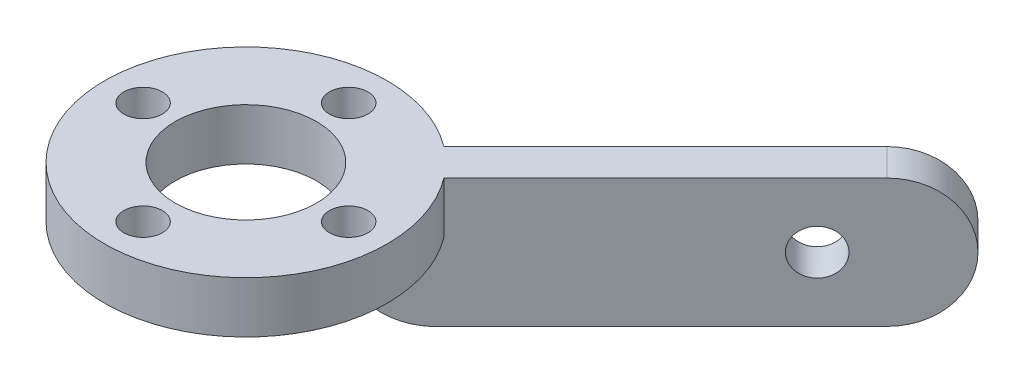
ISO-10303-21;
HEADER;
FILE_DESCRIPTION(('STEP AP214'),'2;1');
FILE_NAME('part.step','',(''),(''),'','','');
FILE_SCHEMA(('AUTOMOTIVE_DESIGN { 1 0 10303 214 1 1 1 1 }'));
ENDSEC;
DATA;
#1=APPLICATION_CONTEXT('core data for automotive mechanical design processes');
#2=APPLICATION_PROTOCOL_DEFINITION('international standard','automotive_design',2000,#1);
#3=PRODUCT_CONTEXT('',#1,'mechanical');
#4=PRODUCT('Part','Part','',(#3));
#5=PRODUCT_RELATED_PRODUCT_CATEGORY('part','',(#4));
#6=PRODUCT_DEFINITION_FORMATION('','',#4);
#7=PRODUCT_DEFINITION_CONTEXT('part definition',#1,'design');
#8=PRODUCT_DEFINITION('design','',#6,#7);
#9=PRODUCT_DEFINITION_SHAPE('','',#8);
#10=(LENGTH_UNIT() NAMED_UNIT(*) SI_UNIT(.MILLI.,.METRE.));
#11=(NAMED_UNIT(*) PLANE_ANGLE_UNIT() SI_UNIT($,.RADIAN.));
#12=(NAMED_UNIT(*) SI_UNIT($,.STERADIAN.) SOLID_ANGLE_UNIT());
#13=UNCERTAINTY_MEASURE_WITH_UNIT(LENGTH_MEASURE(1.E-05),#10,'distance_accuracy_value','');
#14=(GEOMETRIC_REPRESENTATION_CONTEXT(3) GLOBAL_UNCERTAINTY_ASSIGNED_CONTEXT((#13)) GLOBAL_UNIT_ASSIGNED_CONTEXT((#10,
#11,#12)) REPRESENTATION_CONTEXT('',''));
#15=CARTESIAN_POINT('',(0.,0.,0.));
#16=DIRECTION('',(0.,0.,1.));
#17=DIRECTION('',(1.,0.,0.));
#18=AXIS2_PLACEMENT_3D('',#15,#16,#17);
#19=CARTESIAN_POINT('',(0.,0.,0.));
#20=DIRECTION('',(0.,1.,0.));
#21=DIRECTION('',(0.,0.,1.));
#22=AXIS2_PLACEMENT_3D('',#19,#20,#21);
#23=PLANE('',#22);
#24=CARTESIAN_POINT('',(0.,0.,8.));
#25=DIRECTION('',(0.,1.,0.));
#26=DIRECTION('',(0.,0.,1.));
#27=AXIS2_PLACEMENT_3D('',#24,#25,#26);
#28=CIRCLE('',#27,1.5);
#29=CARTESIAN_POINT('',(0.,0.,9.5));
#30=VERTEX_POINT('',#29);
#31=EDGE_CURVE('E230',#30,#30,#28,.T.);
#32=ORIENTED_EDGE('',*,*,#31,.T.);
#33=EDGE_LOOP('',(#32));
#34=FACE_BOUND('',#33,.T.);
#35=CARTESIAN_POINT('',(8.,0.,0.));
#36=DIRECTION('',(0.,1.,0.));
#37=DIRECTION('',(0.,0.,1.));
#38=AXIS2_PLACEMENT_3D('',#35,#36,#37);
#39=CIRCLE('',#38,1.5);
#40=CARTESIAN_POINT('',(8.,0.,1.50000000000005));
#41=VERTEX_POINT('',#40);
#42=EDGE_CURVE('E224',#41,#41,#39,.T.);
#43=ORIENTED_EDGE('',*,*,#42,.T.);
#44=EDGE_LOOP('',(#43));
#45=FACE_BOUND('',#44,.T.);
#46=CARTESIAN_POINT('',(0.,0.,-8.));
#47=DIRECTION('',(0.,1.,0.));
#48=DIRECTION('',(0.,0.,1.));
#49=AXIS2_PLACEMENT_3D('',#46,#47,#48);
#50=CIRCLE('',#49,1.5);
#51=CARTESIAN_POINT('',(0.,0.,-6.5));
#52=VERTEX_POINT('',#51);
#53=EDGE_CURVE('E218',#52,#52,#50,.T.);
#54=ORIENTED_EDGE('',*,*,#53,.T.);
#55=EDGE_LOOP('',(#54));
#56=FACE_BOUND('',#55,.T.);
#57=CARTESIAN_POINT('',(-8.,0.,0.));
#58=DIRECTION('',(0.,1.,0.));
#59=DIRECTION('',(0.,0.,1.));
#60=AXIS2_PLACEMENT_3D('',#57,#58,#59);
#61=CIRCLE('',#60,1.5);
#62=CARTESIAN_POINT('',(-8.,0.,1.5));
#63=VERTEX_POINT('',#62);
#64=EDGE_CURVE('E210',#63,#63,#61,.T.);
#65=ORIENTED_EDGE('',*,*,#64,.T.);
#66=EDGE_LOOP('',(#65));
#67=FACE_BOUND('',#66,.T.);
#68=CARTESIAN_POINT('',(0.,0.,0.));
#69=DIRECTION('',(0.,1.,0.));
#70=DIRECTION('',(0.,0.,1.));
#71=AXIS2_PLACEMENT_3D('',#68,#69,#70);
#72=CIRCLE('',#71,11.);
#73=CARTESIAN_POINT('',(6.64485733193138,0.,-8.76617767549105));
#74=VERTEX_POINT('',#73);
#75=CARTESIAN_POINT('',(8.76617767549103,0.,-6.64485733193141));
#76=VERTEX_POINT('',#75);
#77=EDGE_CURVE('E116',#74,#76,#72,.T.);
#78=ORIENTED_EDGE('',*,*,#77,.F.);
#79=DIRECTION('',(-0.707106781186546,0.,0.707106781186549));
#80=VECTOR('',#79,1.);
#81=CARTESIAN_POINT('',(-1.06066017177982,0.,-1.06066017177982));
#82=LINE('',#81,#80);
#83=CARTESIAN_POINT('',(2.68099721499411,0.,-4.80231755855377));
#84=VERTEX_POINT('',#83);
#85=EDGE_CURVE('E235',#74,#84,#82,.T.);
#86=ORIENTED_EDGE('',*,*,#85,.T.);
#87=CARTESIAN_POINT('',(0.,0.,0.));
#88=DIRECTION('',(0.,1.,0.));
#89=DIRECTION('',(0.,0.,1.));
#90=AXIS2_PLACEMENT_3D('',#87,#88,#89);
#91=CIRCLE('',#90,5.5);
#92=CARTESIAN_POINT('',(4.80231755855376,0.,-2.68099721499413));
#93=VERTEX_POINT('',#92);
#94=EDGE_CURVE('E204',#84,#93,#91,.T.);
#95=ORIENTED_EDGE('',*,*,#94,.T.);
#96=DIRECTION('',(0.707106781186546,0.,-0.707106781186549));
#97=VECTOR('',#96,1.);
#98=CARTESIAN_POINT('',(1.06066017177982,0.,1.06066017177982));
#99=LINE('',#98,#97);
#100=EDGE_CURVE('E117',#93,#76,#99,.T.);
#101=ORIENTED_EDGE('',*,*,#100,.T.);
#102=EDGE_LOOP('',(#78,#86,#95,#101));
#103=FACE_BOUND('',#102,.T.);
#104=ADVANCED_FACE('F33',(#34,#45,#56,#67,#103),#23,.F.);
#105=CARTESIAN_POINT('',(0.,4.,0.));
#106=DIRECTION('',(0.,1.,0.));
#107=DIRECTION('',(0.,0.,1.));
#108=AXIS2_PLACEMENT_3D('',#105,#106,#107);
#109=PLANE('',#108);
#110=CARTESIAN_POINT('',(0.,4.,0.));
#111=DIRECTION('',(0.,1.,0.));
#112=DIRECTION('',(0.,0.,1.));
#113=AXIS2_PLACEMENT_3D('',#110,#111,#112);
#114=CIRCLE('',#113,5.5);
#115=CARTESIAN_POINT('',(0.,4.,5.5));
#116=VERTEX_POINT('',#115);
#117=EDGE_CURVE('E127',#116,#116,#114,.T.);
#118=ORIENTED_EDGE('',*,*,#117,.F.);
#119=EDGE_LOOP('',(#118));
#120=FACE_BOUND('',#119,.T.);
#121=DIRECTION('',(0.707106781186546,0.,-0.707106781186549));
#122=VECTOR('',#121,1.);
#123=CARTESIAN_POINT('',(4.80231755855376,4.,-2.68099721499413));
#124=LINE('',#123,#122);
#125=CARTESIAN_POINT('',(8.76617767549103,4.,-6.64485733193141));
#126=VERTEX_POINT('',#125);
#127=CARTESIAN_POINT('',(26.0155209941502,4.,-23.8942006505906));
#128=VERTEX_POINT('',#127);
#129=EDGE_CURVE('E96',#126,#128,#124,.T.);
#130=ORIENTED_EDGE('',*,*,#129,.T.);
#131=DIRECTION('',(-0.707106781186549,0.,-0.707106781186546));
#132=VECTOR('',#131,1.);
#133=CARTESIAN_POINT('',(24.9548608223703,4.,-24.9548608223704));
#134=LINE('',#133,#132);
#135=CARTESIAN_POINT('',(23.8942006505905,4.,-26.0155209941502));
#136=VERTEX_POINT('',#135);
#137=EDGE_CURVE('E11',#128,#136,#134,.T.);
#138=ORIENTED_EDGE('',*,*,#137,.T.);
#139=DIRECTION('',(-0.707106781186546,0.,0.707106781186549));
#140=VECTOR('',#139,1.);
#141=CARTESIAN_POINT('',(2.68099721499411,4.,-4.80231755855377));
#142=LINE('',#141,#140);
#143=CARTESIAN_POINT('',(6.64485733193138,4.,-8.76617767549105));
#144=VERTEX_POINT('',#143);
#145=EDGE_CURVE('E106',#136,#144,#142,.T.);
#146=ORIENTED_EDGE('',*,*,#145,.T.);
#147=CARTESIAN_POINT('',(0.,4.,0.));
#148=DIRECTION('',(0.,1.,0.));
#149=DIRECTION('',(0.,0.,1.));
#150=AXIS2_PLACEMENT_3D('',#147,#148,#149);
#151=CIRCLE('',#150,11.);
#152=EDGE_CURVE('E114',#144,#126,#151,.T.);
#153=ORIENTED_EDGE('',*,*,#152,.T.);
#154=EDGE_LOOP('',(#130,#138,#146,#153));
#155=FACE_BOUND('',#154,.T.);
#156=CARTESIAN_POINT('',(8.,4.,0.));
#157=DIRECTION('',(0.,1.,0.));
#158=DIRECTION('',(0.,0.,1.));
#159=AXIS2_PLACEMENT_3D('',#156,#157,#158);
#160=CIRCLE('',#159,1.5);
#161=CARTESIAN_POINT('',(8.,4.,1.50000000000005));
#162=VERTEX_POINT('',#161);
#163=EDGE_CURVE('E221',#162,#162,#160,.T.);
#164=ORIENTED_EDGE('',*,*,#163,.F.);
#165=EDGE_LOOP('',(#164));
#166=FACE_BOUND('',#165,.T.);
#167=CARTESIAN_POINT('',(-8.,4.,0.));
#168=DIRECTION('',(0.,1.,0.));
#169=DIRECTION('',(0.,0.,1.));
#170=AXIS2_PLACEMENT_3D('',#167,#168,#169);
#171=CIRCLE('',#170,1.5);
#172=CARTESIAN_POINT('',(-8.,4.,1.5));
#173=VERTEX_POINT('',#172);
#174=EDGE_CURVE('E206',#173,#173,#171,.T.);
#175=ORIENTED_EDGE('',*,*,#174,.F.);
#176=EDGE_LOOP('',(#175));
#177=FACE_BOUND('',#176,.T.);
#178=CARTESIAN_POINT('',(0.,4.,-8.));
#179=DIRECTION('',(0.,1.,0.));
#180=DIRECTION('',(0.,0.,1.));
#181=AXIS2_PLACEMENT_3D('',#178,#179,#180);
#182=CIRCLE('',#181,1.5);
#183=CARTESIAN_POINT('',(0.,4.,-6.5));
#184=VERTEX_POINT('',#183);
#185=EDGE_CURVE('E215',#184,#184,#182,.T.);
#186=ORIENTED_EDGE('',*,*,#185,.F.);
#187=EDGE_LOOP('',(#186));
#188=FACE_BOUND('',#187,.T.);
#189=CARTESIAN_POINT('',(0.,4.,8.));
#190=DIRECTION('',(0.,1.,0.));
#191=DIRECTION('',(0.,0.,1.));
#192=AXIS2_PLACEMENT_3D('',#189,#190,#191);
#193=CIRCLE('',#192,1.5);
#194=CARTESIAN_POINT('',(0.,4.,9.5));
#195=VERTEX_POINT('',#194);
#196=EDGE_CURVE('E227',#195,#195,#193,.T.);
#197=ORIENTED_EDGE('',*,*,#196,.F.);
#198=EDGE_LOOP('',(#197));
#199=FACE_BOUND('',#198,.T.);
#200=ADVANCED_FACE('F120',(#120,#155,#166,#177,#188,#199),#109,.T.);
#201=EDGE_CURVE('E130',#93,#84,#91,.T.);
#202=ORIENTED_EDGE('',*,*,#201,.T.);
#203=CARTESIAN_POINT('',(0.118813200226534,0.,-0.118813200226535));
#204=DIRECTION('',(0.,1.,0.));
#205=DIRECTION('',(0.,0.,1.));
#206=AXIS2_PLACEMENT_3D('',#203,#204,#205);
#207=CIRCLE('',#206,5.33853912601572);
#208=EDGE_CURVE('E200',#84,#93,#207,.F.);
#209=ORIENTED_EDGE('',*,*,#208,.T.);
#210=EDGE_LOOP('',(#202,#209));
#211=FACE_BOUND('',#210,.T.);
#212=ADVANCED_FACE('F182',(#211),#23,.F.);
#213=CARTESIAN_POINT('',(0.,4.,0.));
#214=DIRECTION('',(0.,-1.,0.));
#215=DIRECTION('',(0.,0.,-1.));
#216=AXIS2_PLACEMENT_3D('',#213,#214,#215);
#217=CYLINDRICAL_SURFACE('',#216,11.);
#218=ORIENTED_EDGE('',*,*,#152,.F.);
#219=DIRECTION('',(0.,-1.,0.));
#220=VECTOR('',#219,1.);
#221=CARTESIAN_POINT('',(6.64485733193138,4.,-8.76617767549105));
#222=LINE('',#221,#220);
#223=EDGE_CURVE('E237',#144,#74,#222,.T.);
#224=ORIENTED_EDGE('',*,*,#223,.T.);
#225=ORIENTED_EDGE('',*,*,#77,.T.);
#226=DIRECTION('',(0.,-1.,0.));
#227=VECTOR('',#226,1.);
#228=CARTESIAN_POINT('',(8.76617767549103,4.,-6.64485733193141));
#229=LINE('',#228,#227);
#230=EDGE_CURVE('E101',#76,#126,#229,.F.);
#231=ORIENTED_EDGE('',*,*,#230,.T.);
#232=EDGE_LOOP('',(#218,#224,#225,#231));
#233=FACE_BOUND('',#232,.T.);
#234=ADVANCED_FACE('F112',(#233),#217,.T.);
#235=CARTESIAN_POINT('',(0.,4.,0.));
#236=DIRECTION('',(0.,-1.,0.));
#237=DIRECTION('',(0.,0.,-1.));
#238=AXIS2_PLACEMENT_3D('',#235,#236,#237);
#239=CYLINDRICAL_SURFACE('',#238,5.5);
#240=ORIENTED_EDGE('',*,*,#94,.F.);
#241=ORIENTED_EDGE('',*,*,#201,.F.);
#242=EDGE_LOOP('',(#240,#241));
#243=FACE_BOUND('',#242,.T.);
#244=ORIENTED_EDGE('',*,*,#117,.T.);
#245=EDGE_LOOP('',(#244));
#246=FACE_BOUND('',#245,.T.);
#247=ADVANCED_FACE('F195',(#243,#246),#239,.F.);
#248=CARTESIAN_POINT('',(-8.,4.,0.));
#249=DIRECTION('',(0.,-1.,0.));
#250=DIRECTION('',(0.,0.,-1.));
#251=AXIS2_PLACEMENT_3D('',#248,#249,#250);
#252=CYLINDRICAL_SURFACE('',#251,1.5);
#253=ORIENTED_EDGE('',*,*,#174,.T.);
#254=EDGE_LOOP('',(#253));
#255=FACE_BOUND('',#254,.T.);
#256=ORIENTED_EDGE('',*,*,#64,.F.);
#257=EDGE_LOOP('',(#256));
#258=FACE_BOUND('',#257,.T.);
#259=ADVANCED_FACE('F268',(#255,#258),#252,.F.);
#260=CARTESIAN_POINT('',(0.,4.,-8.));
#261=DIRECTION('',(0.,-1.,0.));
#262=DIRECTION('',(0.,0.,-1.));
#263=AXIS2_PLACEMENT_3D('',#260,#261,#262);
#264=CYLINDRICAL_SURFACE('',#263,1.5);
#265=ORIENTED_EDGE('',*,*,#185,.T.);
#266=EDGE_LOOP('',(#265));
#267=FACE_BOUND('',#266,.T.);
#268=ORIENTED_EDGE('',*,*,#53,.F.);
#269=EDGE_LOOP('',(#268));
#270=FACE_BOUND('',#269,.T.);
#271=ADVANCED_FACE('F274',(#267,#270),#264,.F.);
#272=CARTESIAN_POINT('',(8.,4.,0.));
#273=DIRECTION('',(0.,-1.,0.));
#274=DIRECTION('',(0.,0.,-1.));
#275=AXIS2_PLACEMENT_3D('',#272,#273,#274);
#276=CYLINDRICAL_SURFACE('',#275,1.5);
#277=ORIENTED_EDGE('',*,*,#163,.T.);
#278=EDGE_LOOP('',(#277));
#279=FACE_BOUND('',#278,.T.);
#280=ORIENTED_EDGE('',*,*,#42,.F.);
#281=EDGE_LOOP('',(#280));
#282=FACE_BOUND('',#281,.T.);
#283=ADVANCED_FACE('F279',(#279,#282),#276,.F.);
#284=CARTESIAN_POINT('',(0.,4.,8.));
#285=DIRECTION('',(0.,-1.,0.));
#286=DIRECTION('',(0.,0.,-1.));
#287=AXIS2_PLACEMENT_3D('',#284,#285,#286);
#288=CYLINDRICAL_SURFACE('',#287,1.5);
#289=ORIENTED_EDGE('',*,*,#196,.T.);
#290=EDGE_LOOP('',(#289));
#291=FACE_BOUND('',#290,.T.);
#292=ORIENTED_EDGE('',*,*,#31,.F.);
#293=EDGE_LOOP('',(#292));
#294=FACE_BOUND('',#293,.T.);
#295=ADVANCED_FACE('F283',(#291,#294),#288,.F.);
#296=CARTESIAN_POINT('',(0.118813200226534,-6.,-0.118813200226535));
#297=DIRECTION('',(0.,1.,0.));
#298=DIRECTION('',(0.,0.,1.));
#299=AXIS2_PLACEMENT_3D('',#296,#297,#298);
#300=CYLINDRICAL_SURFACE('',#299,5.33853912601572);
#301=DIRECTION('',(0.,1.,0.));
#302=VECTOR('',#301,1.);
#303=CARTESIAN_POINT('',(2.68099721499411,-6.,-4.80231755855377));
#304=LINE('',#303,#302);
#305=CARTESIAN_POINT('',(2.68099721499411,-1.,-4.80231755855377));
#306=VERTEX_POINT('',#305);
#307=EDGE_CURVE('E118',#306,#84,#304,.T.);
#308=ORIENTED_EDGE('',*,*,#307,.F.);
#309=CARTESIAN_POINT('',(0.118813200226534,-1.,-0.118813200226535));
#310=DIRECTION('',(0.,-1.,0.));
#311=DIRECTION('',(0.,0.,-1.));
#312=AXIS2_PLACEMENT_3D('',#309,#310,#311);
#313=CIRCLE('',#312,5.33853912601572);
#314=CARTESIAN_POINT('',(4.80231755855376,-1.,-2.68099721499413));
#315=VERTEX_POINT('',#314);
#316=EDGE_CURVE('E123',#306,#315,#313,.T.);
#317=ORIENTED_EDGE('',*,*,#316,.T.);
#318=DIRECTION('',(0.,1.,0.));
#319=VECTOR('',#318,1.);
#320=CARTESIAN_POINT('',(4.80231755855376,-6.,-2.68099721499413));
#321=LINE('',#320,#319);
#322=EDGE_CURVE('E240',#315,#93,#321,.T.);
#323=ORIENTED_EDGE('',*,*,#322,.T.);
#324=ORIENTED_EDGE('',*,*,#208,.F.);
#325=EDGE_LOOP('',(#308,#317,#323,#324));
#326=FACE_BOUND('',#325,.T.);
#327=ADVANCED_FACE('F168',(#326),#300,.F.);
#328=CARTESIAN_POINT('',(2.68099721499411,-6.,-4.80231755855377));
#329=DIRECTION('',(-0.707106781186549,0.,-0.707106781186546));
#330=DIRECTION('',(-0.707106781186546,0.,0.707106781186549));
#331=AXIS2_PLACEMENT_3D('',#328,#329,#330);
#332=PLANE('',#331);
#333=CARTESIAN_POINT('',(21.1718395430223,-1.,-23.293159886582));
#334=DIRECTION('',(-0.707106781186549,0.,-0.707106781186546));
#335=DIRECTION('',(-0.707106781186546,0.,0.707106781186549));
#336=AXIS2_PLACEMENT_3D('',#333,#334,#335);
#337=CIRCLE('',#336,1.75);
#338=CARTESIAN_POINT('',(19.9344026759458,-1.,-22.0557230195055));
#339=VERTEX_POINT('',#338);
#340=EDGE_CURVE('E107',#339,#339,#337,.T.);
#341=ORIENTED_EDGE('',*,*,#340,.F.);
#342=EDGE_LOOP('',(#341));
#343=FACE_BOUND('',#342,.T.);
#344=DIRECTION('',(-0.707106781186546,0.,0.707106781186549));
#345=VECTOR('',#344,1.);
#346=CARTESIAN_POINT('',(2.68099721499411,-6.,-4.80231755855377));
#347=LINE('',#346,#345);
#348=CARTESIAN_POINT('',(23.8942006505905,-6.,-26.0155209941502));
#349=VERTEX_POINT('',#348);
#350=CARTESIAN_POINT('',(6.29125026476801,-6.,-8.41257060832767));
#351=VERTEX_POINT('',#350);
#352=EDGE_CURVE('E242',#349,#351,#347,.T.);
#353=ORIENTED_EDGE('',*,*,#352,.T.);
#354=CARTESIAN_POINT('',(6.29125026476801,-6.,-8.41257060832767));
#355=CARTESIAN_POINT('',(6.18895013544998,-6.00001540162238,-8.31027047900965));
#356=CARTESIAN_POINT('',(6.08665370620415,-5.99385368432688,-8.20797404976382));
#357=CARTESIAN_POINT('',(5.88280463192301,-5.96932179797099,-8.00412497548268));
#358=CARTESIAN_POINT('',(5.78125191719985,-5.95095278795276,-7.90257226075951));
#359=CARTESIAN_POINT('',(5.57970530618417,-5.9021758519802,-7.70102564974384));
#360=CARTESIAN_POINT('',(5.47970998594104,-5.87177968712067,-7.60103032950071));
#361=CARTESIAN_POINT('',(5.28188271423237,-5.79919681202536,-7.40320305779203));
#362=CARTESIAN_POINT('',(5.18405076606926,-5.75701008379236,-7.30537110962892));
#363=CARTESIAN_POINT('',(4.9912313744573,-5.6611627266798,-7.11255171801696));
#364=CARTESIAN_POINT('',(4.89624413255959,-5.60750128698427,-7.01756447611926));
#365=CARTESIAN_POINT('',(4.70975270293728,-5.48907893036431,-6.83107304649694));
#366=CARTESIAN_POINT('',(4.61824981134987,-5.42431393139979,-6.73957015490954));
#367=CARTESIAN_POINT('',(4.43944119021659,-5.28418784633812,-6.56076153377626));
#368=CARTESIAN_POINT('',(4.35213385081144,-5.20883086872204,-6.47345419437111));
#369=CARTESIAN_POINT('',(4.18226565249126,-5.0479997575245,-6.30358599605092));
#370=CARTESIAN_POINT('',(4.09970645397597,-4.9625221163788,-6.22102679753563));
#371=CARTESIAN_POINT('',(3.93963320260115,-4.78168830124938,-6.06095354616081));
#372=CARTESIAN_POINT('',(3.86214108955894,-4.68629327575465,-5.9834614331186));
#373=CARTESIAN_POINT('',(3.7131460997494,-4.48656772364571,-5.83446644330906));
#374=CARTESIAN_POINT('',(3.64164315729724,-4.38223729505381,-5.7629635008569));
#375=CARTESIAN_POINT('',(3.50514326553127,-4.16530134922695,-5.62646360909093));
#376=CARTESIAN_POINT('',(3.44014917076755,-4.05269223847283,-5.5614695143272));
#377=CARTESIAN_POINT('',(3.31724778272269,-3.8200518357946,-5.43856812628235));
#378=CARTESIAN_POINT('',(3.25933778784346,-3.70002339976297,-5.38065813140312));
#379=CARTESIAN_POINT('',(3.15157368194983,-3.45448768569237,-5.27289402550949));
#380=CARTESIAN_POINT('',(3.10164941383774,-3.32904201421141,-5.2229697573974));
#381=CARTESIAN_POINT('',(3.00967408650337,-3.07256689419393,-5.13099443006303));
#382=CARTESIAN_POINT('',(2.96761978727273,-2.94153977089509,-5.08894013083238));
#383=CARTESIAN_POINT('',(2.89178996898985,-2.67489003827967,-5.01311031254951));
#384=CARTESIAN_POINT('',(2.85800801556256,-2.53927109462734,-4.97932835912222));
#385=CARTESIAN_POINT('',(2.79903584318945,-2.26440792902289,-4.92035618674911));
#386=CARTESIAN_POINT('',(2.77384271674511,-2.12516495109754,-4.89516306030477));
#387=CARTESIAN_POINT('',(2.7291586310389,-1.82272602562253,-4.85047897459855));
#388=CARTESIAN_POINT('',(2.71110840429951,-1.65909525019573,-4.83242874785917));
#389=CARTESIAN_POINT('',(2.69304881618489,-1.41248965796085,-4.81436915974454));
#390=CARTESIAN_POINT('',(2.68853158495721,-1.33012604132991,-4.80985192851686));
#391=CARTESIAN_POINT('',(2.68250570978103,-1.16518043627419,-4.80382605334069));
#392=CARTESIAN_POINT('',(2.68099701418298,-1.08259845162265,-4.80231735774264));
#393=CARTESIAN_POINT('',(2.68099721499411,-1.,-4.80231755855377));
#394=B_SPLINE_CURVE_WITH_KNOTS('',3,(#354,#355,#356,#357,#358,#359,#360,#361,#362,#363,#364,
#365,#366,#367,#368,#369,#370,#371,#372,#373,#374,#375,#376,#377,#378,#379,#380,#381,#382,#383,
#384,#385,#386,#387,#388,#389,#390,#391,#392,#393),.UNSPECIFIED.,.F.,.F.,(4,2,2,2,2,2,2,2,2,2,2,
2,2,2,2,2,2,2,2,4),(0.,0.433884004171063,0.867726818372865,1.30114643140091,1.73456670600863,
2.16801761670558,2.60162822151652,3.03507109658953,3.46866463407578,3.90402581604913,
4.33938222267574,4.7749287326613,5.21030862100394,5.64162412400326,6.07276166504622,
6.50356278692487,6.93421792841881,7.43007259698672,7.67781191481389,7.92554697949688),.UNSPECIFIED.);
#395=EDGE_CURVE('E42',#351,#306,#394,.T.);
#396=ORIENTED_EDGE('',*,*,#395,.T.);
#397=ORIENTED_EDGE('',*,*,#307,.T.);
#398=ORIENTED_EDGE('',*,*,#85,.F.);
#399=ORIENTED_EDGE('',*,*,#223,.F.);
#400=ORIENTED_EDGE('',*,*,#145,.F.);
#401=CARTESIAN_POINT('',(23.8942006505905,-1.,-26.0155209941502));
#402=DIRECTION('',(-0.707106781186549,0.,-0.707106781186546));
#403=DIRECTION('',(-0.707106781186546,0.,0.707106781186549));
#404=AXIS2_PLACEMENT_3D('',#401,#402,#403);
#405=CIRCLE('',#404,5.);
#406=CARTESIAN_POINT('',(27.4297345565232,-1.,-29.551054900083));
#407=VERTEX_POINT('',#406);
#408=EDGE_CURVE('E49',#136,#407,#405,.T.);
#409=ORIENTED_EDGE('',*,*,#408,.T.);
#410=CARTESIAN_POINT('',(23.8942006505905,-1.,-26.0155209941502));
#411=DIRECTION('',(-0.707106781186549,0.,-0.707106781186546));
#412=DIRECTION('',(-0.707106781186546,0.,0.707106781186549));
#413=AXIS2_PLACEMENT_3D('',#410,#411,#412);
#414=CIRCLE('',#413,5.);
#415=EDGE_CURVE('E162',#407,#349,#414,.T.);
#416=ORIENTED_EDGE('',*,*,#415,.T.);
#417=EDGE_LOOP('',(#353,#396,#397,#398,#399,#400,#409,#416));
#418=FACE_BOUND('',#417,.T.);
#419=ADVANCED_FACE('F164',(#343,#418),#332,.T.);
#420=CARTESIAN_POINT('',(4.80231755855376,-6.,-2.68099721499413));
#421=DIRECTION('',(0.707106781186549,0.,0.707106781186546));
#422=DIRECTION('',(0.707106781186546,0.,-0.707106781186549));
#423=AXIS2_PLACEMENT_3D('',#420,#421,#422);
#424=PLANE('',#423);
#425=CARTESIAN_POINT('',(23.2931598865819,-1.,-21.1718395430224));
#426=DIRECTION('',(0.707106781186549,0.,0.707106781186546));
#427=DIRECTION('',(0.707106781186546,0.,-0.707106781186549));
#428=AXIS2_PLACEMENT_3D('',#425,#426,#427);
#429=CIRCLE('',#428,1.75);
#430=CARTESIAN_POINT('',(24.5305967536584,-1.,-22.4092764100988));
#431=VERTEX_POINT('',#430);
#432=EDGE_CURVE('E250',#431,#431,#429,.F.);
#433=ORIENTED_EDGE('',*,*,#432,.T.);
#434=EDGE_LOOP('',(#433));
#435=FACE_BOUND('',#434,.T.);
#436=ORIENTED_EDGE('',*,*,#322,.F.);
#437=CARTESIAN_POINT('',(4.80231755855376,-1.,-2.68099721499413));
#438=CARTESIAN_POINT('',(4.80230203169504,-1.13748782655183,-2.68098168813541));
#439=CARTESIAN_POINT('',(4.80649518826695,-1.27496909041508,-2.68517484470732));
#440=CARTESIAN_POINT('',(4.82318388939639,-1.54889436079581,-2.70186354583676));
#441=CARTESIAN_POINT('',(4.83567782913399,-1.68533856265583,-2.71435748557436));
#442=CARTESIAN_POINT('',(4.86881674463533,-1.95592183506917,-2.7474964010757));
#443=CARTESIAN_POINT('',(4.8894437463905,-2.09006531262724,-2.76812340283087));
#444=CARTESIAN_POINT('',(4.93863513032846,-2.35540694698369,-2.81731478676883));
#445=CARTESIAN_POINT('',(4.96719967223226,-2.48660504445705,-2.84587932867263));
#446=CARTESIAN_POINT('',(5.03198394445105,-2.74510370763883,-2.91066360089142));
#447=CARTESIAN_POINT('',(5.06820017634635,-2.87240602418402,-2.94687983278672));
#448=CARTESIAN_POINT('',(5.14796543043079,-3.12234639760708,-3.02664508687116));
#449=CARTESIAN_POINT('',(5.19151717275189,-3.24498270349271,-3.07019682919226));
#450=CARTESIAN_POINT('',(5.33264939833391,-3.60466079920242,-3.21132905477428));
#451=CARTESIAN_POINT('',(5.44075317886505,-3.83365505507746,-3.31943283530543));
#452=CARTESIAN_POINT('',(5.68446389232266,-4.2691154414292,-3.56314354876303));
#453=CARTESIAN_POINT('',(5.82067180677147,-4.47490422090219,-3.69935146321185));
#454=CARTESIAN_POINT('',(6.11502638455316,-4.85236842437678,-3.99370604099354));
#455=CARTESIAN_POINT('',(6.27317765336851,-5.02403666869651,-4.15185730980888));
#456=CARTESIAN_POINT('',(6.61173662169835,-5.33299287733997,-4.49041627813873));
#457=CARTESIAN_POINT('',(6.79264066305376,-5.46919292397116,-4.67132031949414));
#458=CARTESIAN_POINT('',(7.16796392525029,-5.69690009479535,-5.04664358169067));
#459=CARTESIAN_POINT('',(7.36237643738791,-5.78842922519505,-5.24105609382829));
#460=CARTESIAN_POINT('',(7.7001414895105,-5.90393474547458,-5.57882114595088));
#461=CARTESIAN_POINT('',(7.84150244920235,-5.9399021309745,-5.72018210564273));
#462=CARTESIAN_POINT('',(8.12607769513397,-5.98793984765829,-6.00475735157435));
#463=CARTESIAN_POINT('',(8.26928973017599,-6.00003687810687,-6.14796938661637));
#464=CARTESIAN_POINT('',(8.41257060832765,-6.,-6.29125026476804));
#465=B_SPLINE_CURVE_WITH_KNOTS('',3,(#437,#438,#439,#440,#441,#442,#443,#444,#445,#446,#447,
#448,#449,#450,#451,#452,#453,#454,#455,#456,#457,#458,#459,#460,#461,#462,#463,#464),
.UNSPECIFIED.,.F.,.F.,(4,2,2,2,2,2,2,2,2,2,2,2,2,4),(0.,0.412325469413682,0.824571245666675,
1.23591102272524,1.64725907745691,2.05841946567752,2.46973265618523,3.29178220802128,
4.13367794611842,4.97575064976342,5.84122288692194,6.70626833557015,7.31429516505252,
7.92164152321322),.UNSPECIFIED.);
#466=CARTESIAN_POINT('',(8.41257060832765,-6.,-6.29125026476804));
#467=VERTEX_POINT('',#466);
#468=EDGE_CURVE('E136',#315,#467,#465,.T.);
#469=ORIENTED_EDGE('',*,*,#468,.T.);
#470=DIRECTION('',(0.707106781186546,0.,-0.707106781186549));
#471=VECTOR('',#470,1.);
#472=CARTESIAN_POINT('',(4.80231755855376,-6.,-2.68099721499413));
#473=LINE('',#472,#471);
#474=CARTESIAN_POINT('',(26.0155209941502,-6.,-23.8942006505906));
#475=VERTEX_POINT('',#474);
#476=EDGE_CURVE('E244',#467,#475,#473,.T.);
#477=ORIENTED_EDGE('',*,*,#476,.T.);
#478=CARTESIAN_POINT('',(26.0155209941501,-1.,-23.8942006505906));
#479=DIRECTION('',(0.707106781186549,0.,0.707106781186546));
#480=DIRECTION('',(0.707106781186546,0.,-0.707106781186549));
#481=AXIS2_PLACEMENT_3D('',#478,#479,#480);
#482=CIRCLE('',#481,5.);
#483=CARTESIAN_POINT('',(29.5510549000829,-1.,-27.4297345565233));
#484=VERTEX_POINT('',#483);
#485=EDGE_CURVE('E134',#475,#484,#482,.T.);
#486=ORIENTED_EDGE('',*,*,#485,.T.);
#487=CARTESIAN_POINT('',(26.0155209941502,-1.,-23.8942006505906));
#488=DIRECTION('',(0.707106781186549,0.,0.707106781186546));
#489=DIRECTION('',(0.707106781186546,0.,-0.707106781186549));
#490=AXIS2_PLACEMENT_3D('',#487,#488,#489);
#491=CIRCLE('',#490,5.);
#492=EDGE_CURVE('E104',#484,#128,#491,.T.);
#493=ORIENTED_EDGE('',*,*,#492,.T.);
#494=ORIENTED_EDGE('',*,*,#129,.F.);
#495=ORIENTED_EDGE('',*,*,#230,.F.);
#496=ORIENTED_EDGE('',*,*,#100,.F.);
#497=EDGE_LOOP('',(#436,#469,#477,#486,#493,#494,#495,#496));
#498=FACE_BOUND('',#497,.T.);
#499=ADVANCED_FACE('F99',(#435,#498),#424,.T.);
#500=CARTESIAN_POINT('',(0.118813200226534,-6.,-0.118813200226535));
#501=DIRECTION('',(0.,-1.,0.));
#502=DIRECTION('',(0.,0.,-1.));
#503=AXIS2_PLACEMENT_3D('',#500,#501,#502);
#504=PLANE('',#503);
#505=ORIENTED_EDGE('',*,*,#476,.F.);
#506=CARTESIAN_POINT('',(0.118813200226534,-6.,-0.118813200226535));
#507=DIRECTION('',(0.,-1.,0.));
#508=DIRECTION('',(0.,0.,-1.));
#509=AXIS2_PLACEMENT_3D('',#506,#507,#508);
#510=CIRCLE('',#509,10.3385391260157);
#511=EDGE_CURVE('E263',#467,#351,#510,.F.);
#512=ORIENTED_EDGE('',*,*,#511,.T.);
#513=ORIENTED_EDGE('',*,*,#352,.F.);
#514=DIRECTION('',(-0.707106781186549,0.,-0.707106781186546));
#515=VECTOR('',#514,1.);
#516=CARTESIAN_POINT('',(24.9548608223703,-6.,-24.9548608223704));
#517=LINE('',#516,#515);
#518=EDGE_CURVE('E143',#349,#475,#517,.F.);
#519=ORIENTED_EDGE('',*,*,#518,.T.);
#520=EDGE_LOOP('',(#505,#512,#513,#519));
#521=FACE_BOUND('',#520,.T.);
#522=ADVANCED_FACE('F170',(#521),#504,.T.);
#523=CARTESIAN_POINT('',(42.5090271648436,-1.,-1.95597226476077));
#524=DIRECTION('',(-0.707106781186549,0.,-0.707106781186546));
#525=DIRECTION('',(-0.707106781186546,0.,0.707106781186549));
#526=AXIS2_PLACEMENT_3D('',#523,#524,#525);
#527=CYLINDRICAL_SURFACE('',#526,1.75);
#528=ORIENTED_EDGE('',*,*,#432,.F.);
#529=EDGE_LOOP('',(#528));
#530=FACE_BOUND('',#529,.T.);
#531=ORIENTED_EDGE('',*,*,#340,.T.);
#532=EDGE_LOOP('',(#531));
#533=FACE_BOUND('',#532,.T.);
#534=ADVANCED_FACE('F152',(#530,#533),#527,.F.);
#535=CARTESIAN_POINT('',(0.118813200226534,-1.,-0.118813200226535));
#536=DIRECTION('',(0.,-1.,0.));
#537=DIRECTION('',(0.,0.,-1.));
#538=AXIS2_PLACEMENT_3D('',#535,#536,#537);
#539=TOROIDAL_SURFACE('',#538,10.3385391260157,5.);
#540=ORIENTED_EDGE('',*,*,#395,.F.);
#541=ORIENTED_EDGE('',*,*,#511,.F.);
#542=ORIENTED_EDGE('',*,*,#468,.F.);
#543=ORIENTED_EDGE('',*,*,#316,.F.);
#544=EDGE_LOOP('',(#540,#541,#542,#543));
#545=FACE_BOUND('',#544,.T.);
#546=ADVANCED_FACE('F148',(#545),#539,.T.);
#547=CARTESIAN_POINT('',(24.9548608223703,-1.,-24.9548608223704));
#548=DIRECTION('',(-0.707106781186549,0.,-0.707106781186546));
#549=DIRECTION('',(-0.707106781186546,0.,0.707106781186549));
#550=AXIS2_PLACEMENT_3D('',#547,#548,#549);
#551=CYLINDRICAL_SURFACE('',#550,5.);
#552=ORIENTED_EDGE('',*,*,#137,.F.);
#553=ORIENTED_EDGE('',*,*,#492,.F.);
#554=DIRECTION('',(-0.707106781186549,0.,-0.707106781186546));
#555=VECTOR('',#554,1.);
#556=CARTESIAN_POINT('',(27.4297345565232,-1.,-29.551054900083));
#557=LINE('',#556,#555);
#558=EDGE_CURVE('E37',#407,#484,#557,.F.);
#559=ORIENTED_EDGE('',*,*,#558,.F.);
#560=ORIENTED_EDGE('',*,*,#408,.F.);
#561=EDGE_LOOP('',(#552,#553,#559,#560));
#562=FACE_BOUND('',#561,.T.);
#563=ADVANCED_FACE('F35',(#562),#551,.T.);
#564=CARTESIAN_POINT('',(23.8942006505905,-1.,-26.0155209941502));
#565=DIRECTION('',(-0.707106781186549,0.,-0.707106781186546));
#566=DIRECTION('',(-0.707106781186546,0.,0.707106781186549));
#567=AXIS2_PLACEMENT_3D('',#564,#565,#566);
#568=CYLINDRICAL_SURFACE('',#567,5.);
#569=ORIENTED_EDGE('',*,*,#485,.F.);
#570=ORIENTED_EDGE('',*,*,#518,.F.);
#571=ORIENTED_EDGE('',*,*,#415,.F.);
#572=ORIENTED_EDGE('',*,*,#558,.T.);
#573=EDGE_LOOP('',(#569,#570,#571,#572));
#574=FACE_BOUND('',#573,.T.);
#575=ADVANCED_FACE('F155',(#574),#568,.T.);
#576=CLOSED_SHELL('',(#104,#200,#212,#234,#247,#259,#271,#283,#295,#327,#419,#499,#522,#534,
#546,#563,#575));
#577=MANIFOLD_SOLID_BREP('B2',#576);
#578=ADVANCED_BREP_SHAPE_REPRESENTATION('',(#18,#577),#14);
#579=SHAPE_DEFINITION_REPRESENTATION(#9,#578);
ENDSEC;
END-ISO-10303-21;
